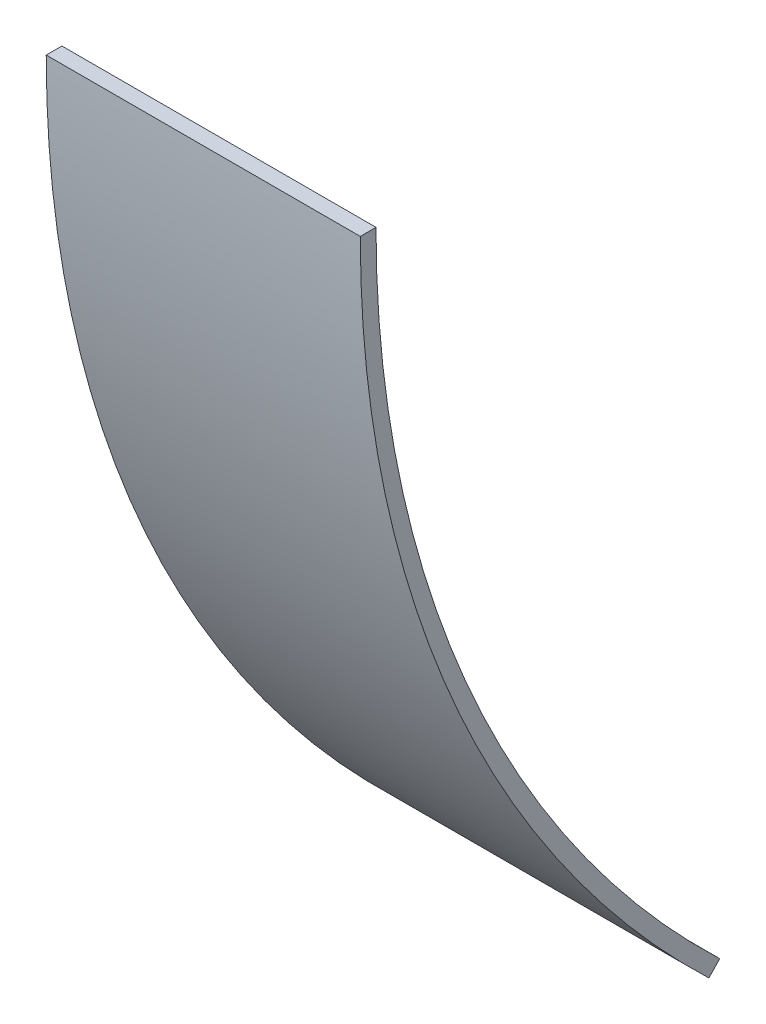
ISO-10303-21;
HEADER;
FILE_DESCRIPTION(('STEP AP214'),'2;1');
FILE_NAME('part.step','',(''),(''),'','','');
FILE_SCHEMA(('AUTOMOTIVE_DESIGN { 1 0 10303 214 1 1 1 1 }'));
ENDSEC;
DATA;
#1=APPLICATION_CONTEXT('core data for automotive mechanical design processes');
#2=APPLICATION_PROTOCOL_DEFINITION('international standard','automotive_design',2000,#1);
#3=PRODUCT_CONTEXT('',#1,'mechanical');
#4=PRODUCT('Part','Part','',(#3));
#5=PRODUCT_RELATED_PRODUCT_CATEGORY('part','',(#4));
#6=PRODUCT_DEFINITION_FORMATION('','',#4);
#7=PRODUCT_DEFINITION_CONTEXT('part definition',#1,'design');
#8=PRODUCT_DEFINITION('design','',#6,#7);
#9=PRODUCT_DEFINITION_SHAPE('','',#8);
#10=(LENGTH_UNIT() NAMED_UNIT(*) SI_UNIT(.MILLI.,.METRE.));
#11=(NAMED_UNIT(*) PLANE_ANGLE_UNIT() SI_UNIT($,.RADIAN.));
#12=(NAMED_UNIT(*) SI_UNIT($,.STERADIAN.) SOLID_ANGLE_UNIT());
#13=UNCERTAINTY_MEASURE_WITH_UNIT(LENGTH_MEASURE(1.E-05),#10,'distance_accuracy_value','');
#14=(GEOMETRIC_REPRESENTATION_CONTEXT(3) GLOBAL_UNCERTAINTY_ASSIGNED_CONTEXT((#13)) GLOBAL_UNIT_ASSIGNED_CONTEXT((#10,
#11,#12)) REPRESENTATION_CONTEXT('',''));
#15=CARTESIAN_POINT('',(0.,0.,0.));
#16=DIRECTION('',(0.,0.,1.));
#17=DIRECTION('',(1.,0.,0.));
#18=AXIS2_PLACEMENT_3D('',#15,#16,#17);
#19=CARTESIAN_POINT('',(31.75,0.,-228.6));
#20=DIRECTION('',(-1.,0.,0.));
#21=DIRECTION('',(0.,0.,1.));
#22=AXIS2_PLACEMENT_3D('',#19,#20,#21);
#23=CYLINDRICAL_SURFACE('',#22,228.6);
#24=CARTESIAN_POINT('',(-31.75,0.,-228.6));
#25=DIRECTION('',(1.,0.,0.));
#26=DIRECTION('',(0.,0.,-1.));
#27=AXIS2_PLACEMENT_3D('',#24,#25,#26);
#28=CIRCLE('',#27,228.6);
#29=CARTESIAN_POINT('',(-31.75,0.,0.));
#30=VERTEX_POINT('',#29);
#31=CARTESIAN_POINT('',(-31.75,-165.1,-70.486275105543));
#32=VERTEX_POINT('',#31);
#33=EDGE_CURVE('E95',#30,#32,#28,.T.);
#34=ORIENTED_EDGE('',*,*,#33,.T.);
#35=DIRECTION('',(-1.,0.,0.));
#36=VECTOR('',#35,1.);
#37=CARTESIAN_POINT('',(31.75,-165.1,-70.486275105543));
#38=LINE('',#37,#36);
#39=CARTESIAN_POINT('',(31.75,-165.1,-70.486275105543));
#40=VERTEX_POINT('',#39);
#41=EDGE_CURVE('E11',#40,#32,#38,.T.);
#42=ORIENTED_EDGE('',*,*,#41,.F.);
#43=CARTESIAN_POINT('',(31.75,0.,-228.6));
#44=DIRECTION('',(1.,0.,0.));
#45=DIRECTION('',(0.,0.,-1.));
#46=AXIS2_PLACEMENT_3D('',#43,#44,#45);
#47=CIRCLE('',#46,228.6);
#48=CARTESIAN_POINT('',(31.75,0.,0.));
#49=VERTEX_POINT('',#48);
#50=EDGE_CURVE('E72',#49,#40,#47,.T.);
#51=ORIENTED_EDGE('',*,*,#50,.F.);
#52=DIRECTION('',(-1.,0.,0.));
#53=VECTOR('',#52,1.);
#54=CARTESIAN_POINT('',(31.75,0.,0.));
#55=LINE('',#54,#53);
#56=EDGE_CURVE('E48',#49,#30,#55,.T.);
#57=ORIENTED_EDGE('',*,*,#56,.T.);
#58=EDGE_LOOP('',(#34,#42,#51,#57));
#59=FACE_BOUND('',#58,.T.);
#60=ADVANCED_FACE('F32',(#59),#23,.T.);
#61=CARTESIAN_POINT('',(31.75,-162.806944444444,-72.6822990624105));
#62=DIRECTION('',(0.,-0.691661088777152,-0.722222222222222));
#63=DIRECTION('',(0.,0.722222222222222,-0.691661088777152));
#64=AXIS2_PLACEMENT_3D('',#61,#62,#63);
#65=PLANE('',#64);
#66=DIRECTION('',(0.,-0.722222222222222,0.691661088777152));
#67=VECTOR('',#66,1.);
#68=CARTESIAN_POINT('',(-31.75,-162.806944444444,-72.6822990624105));
#69=LINE('',#68,#67);
#70=CARTESIAN_POINT('',(-31.75,-162.806944444444,-72.6822990624105));
#71=VERTEX_POINT('',#70);
#72=EDGE_CURVE('E81',#71,#32,#69,.T.);
#73=ORIENTED_EDGE('',*,*,#72,.F.);
#74=DIRECTION('',(-1.,0.,0.));
#75=VECTOR('',#74,1.);
#76=CARTESIAN_POINT('',(31.75,-162.806944444444,-72.6822990624105));
#77=LINE('',#76,#75);
#78=CARTESIAN_POINT('',(31.75,-162.806944444444,-72.6822990624105));
#79=VERTEX_POINT('',#78);
#80=EDGE_CURVE('E40',#79,#71,#77,.T.);
#81=ORIENTED_EDGE('',*,*,#80,.F.);
#82=DIRECTION('',(0.,-0.722222222222222,0.691661088777152));
#83=VECTOR('',#82,1.);
#84=CARTESIAN_POINT('',(31.75,-162.806944444444,-72.6822990624105));
#85=LINE('',#84,#83);
#86=EDGE_CURVE('E79',#79,#40,#85,.T.);
#87=ORIENTED_EDGE('',*,*,#86,.T.);
#88=ORIENTED_EDGE('',*,*,#41,.T.);
#89=EDGE_LOOP('',(#73,#81,#87,#88));
#90=FACE_BOUND('',#89,.T.);
#91=ADVANCED_FACE('F78',(#90),#65,.T.);
#92=CARTESIAN_POINT('',(31.75,0.,-228.6));
#93=DIRECTION('',(-1.,0.,0.));
#94=DIRECTION('',(0.,0.,1.));
#95=AXIS2_PLACEMENT_3D('',#92,#93,#94);
#96=CYLINDRICAL_SURFACE('',#95,225.425);
#97=CARTESIAN_POINT('',(-31.75,0.,-228.6));
#98=DIRECTION('',(1.,0.,0.));
#99=DIRECTION('',(0.,0.,-1.));
#100=AXIS2_PLACEMENT_3D('',#97,#98,#99);
#101=CIRCLE('',#100,225.425);
#102=CARTESIAN_POINT('',(-31.75,0.,-3.17499999999998));
#103=VERTEX_POINT('',#102);
#104=EDGE_CURVE('E98',#103,#71,#101,.T.);
#105=ORIENTED_EDGE('',*,*,#104,.F.);
#106=DIRECTION('',(-1.,0.,0.));
#107=VECTOR('',#106,1.);
#108=CARTESIAN_POINT('',(31.75,0.,-3.17499999999998));
#109=LINE('',#108,#107);
#110=CARTESIAN_POINT('',(31.75,0.,-3.17499999999998));
#111=VERTEX_POINT('',#110);
#112=EDGE_CURVE('E61',#111,#103,#109,.T.);
#113=ORIENTED_EDGE('',*,*,#112,.F.);
#114=CARTESIAN_POINT('',(31.75,0.,-228.6));
#115=DIRECTION('',(1.,0.,0.));
#116=DIRECTION('',(0.,0.,-1.));
#117=AXIS2_PLACEMENT_3D('',#114,#115,#116);
#118=CIRCLE('',#117,225.425);
#119=EDGE_CURVE('E87',#111,#79,#118,.T.);
#120=ORIENTED_EDGE('',*,*,#119,.T.);
#121=ORIENTED_EDGE('',*,*,#80,.T.);
#122=EDGE_LOOP('',(#105,#113,#120,#121));
#123=FACE_BOUND('',#122,.T.);
#124=ADVANCED_FACE('F89',(#123),#96,.F.);
#125=CARTESIAN_POINT('',(31.75,0.,0.));
#126=DIRECTION('',(0.,1.,0.));
#127=DIRECTION('',(0.,0.,1.));
#128=AXIS2_PLACEMENT_3D('',#125,#126,#127);
#129=PLANE('',#128);
#130=DIRECTION('',(0.,0.,-1.));
#131=VECTOR('',#130,1.);
#132=CARTESIAN_POINT('',(-31.75,0.,0.));
#133=LINE('',#132,#131);
#134=EDGE_CURVE('E100',#30,#103,#133,.T.);
#135=ORIENTED_EDGE('',*,*,#134,.F.);
#136=ORIENTED_EDGE('',*,*,#56,.F.);
#137=DIRECTION('',(0.,0.,-1.));
#138=VECTOR('',#137,1.);
#139=CARTESIAN_POINT('',(31.75,0.,0.));
#140=LINE('',#139,#138);
#141=EDGE_CURVE('E90',#49,#111,#140,.T.);
#142=ORIENTED_EDGE('',*,*,#141,.T.);
#143=ORIENTED_EDGE('',*,*,#112,.T.);
#144=EDGE_LOOP('',(#135,#136,#142,#143));
#145=FACE_BOUND('',#144,.T.);
#146=ADVANCED_FACE('F106',(#145),#129,.T.);
#147=CARTESIAN_POINT('',(31.75,0.,-228.6));
#148=DIRECTION('',(1.,0.,0.));
#149=DIRECTION('',(0.,0.,-1.));
#150=AXIS2_PLACEMENT_3D('',#147,#148,#149);
#151=PLANE('',#150);
#152=ORIENTED_EDGE('',*,*,#50,.T.);
#153=ORIENTED_EDGE('',*,*,#86,.F.);
#154=ORIENTED_EDGE('',*,*,#119,.F.);
#155=ORIENTED_EDGE('',*,*,#141,.F.);
#156=EDGE_LOOP('',(#152,#153,#154,#155));
#157=FACE_BOUND('',#156,.T.);
#158=ADVANCED_FACE('F86',(#157),#151,.T.);
#159=CARTESIAN_POINT('',(-31.75,0.,-228.6));
#160=DIRECTION('',(1.,0.,0.));
#161=DIRECTION('',(0.,0.,-1.));
#162=AXIS2_PLACEMENT_3D('',#159,#160,#161);
#163=PLANE('',#162);
#164=ORIENTED_EDGE('',*,*,#33,.F.);
#165=ORIENTED_EDGE('',*,*,#134,.T.);
#166=ORIENTED_EDGE('',*,*,#104,.T.);
#167=ORIENTED_EDGE('',*,*,#72,.T.);
#168=EDGE_LOOP('',(#164,#165,#166,#167));
#169=FACE_BOUND('',#168,.T.);
#170=ADVANCED_FACE('F105',(#169),#163,.F.);
#171=CLOSED_SHELL('',(#60,#91,#124,#146,#158,#170));
#172=MANIFOLD_SOLID_BREP('B2',#171);
#173=ADVANCED_BREP_SHAPE_REPRESENTATION('',(#18,#172),#14);
#174=SHAPE_DEFINITION_REPRESENTATION(#9,#173);
ENDSEC;
END-ISO-10303-21;
